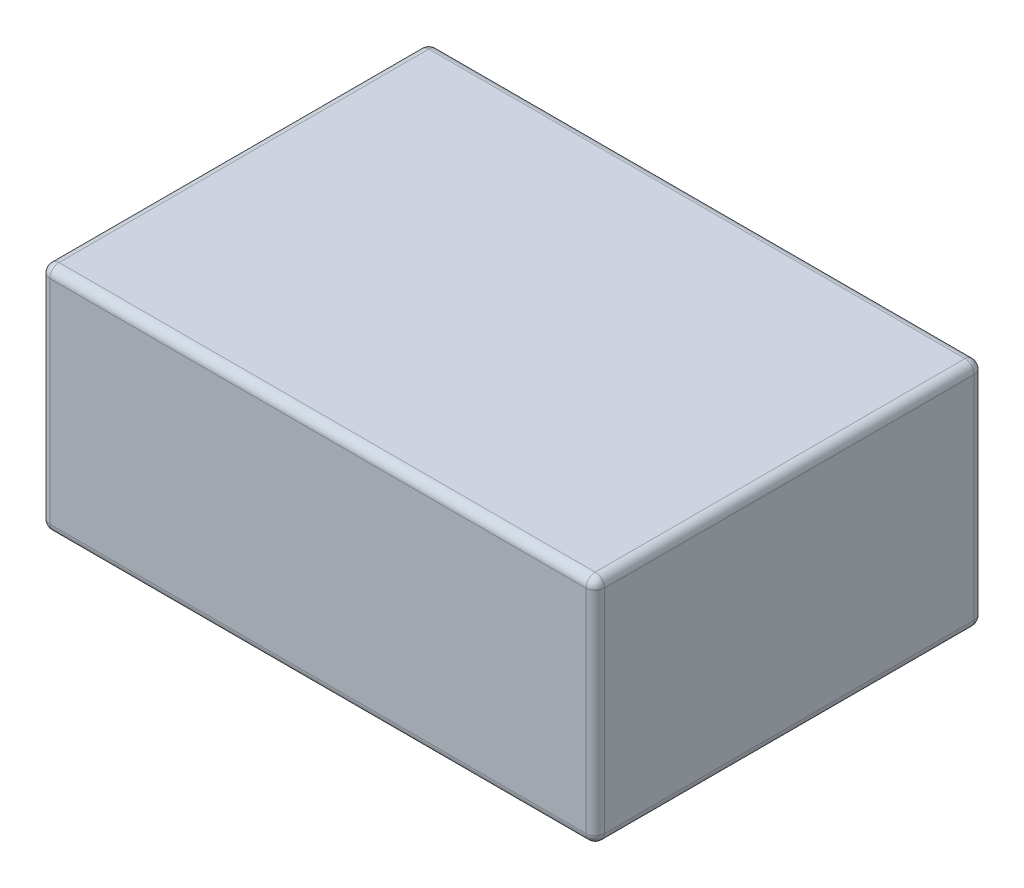
ISO-10303-21;
HEADER;
FILE_DESCRIPTION(('STEP AP214'),'2;1');
FILE_NAME('part.step','',(''),(''),'','','');
FILE_SCHEMA(('AUTOMOTIVE_DESIGN { 1 0 10303 214 1 1 1 1 }'));
ENDSEC;
DATA;
#1=APPLICATION_CONTEXT('core data for automotive mechanical design processes');
#2=APPLICATION_PROTOCOL_DEFINITION('international standard','automotive_design',2000,#1);
#3=PRODUCT_CONTEXT('',#1,'mechanical');
#4=PRODUCT('Part','Part','',(#3));
#5=PRODUCT_RELATED_PRODUCT_CATEGORY('part','',(#4));
#6=PRODUCT_DEFINITION_FORMATION('','',#4);
#7=PRODUCT_DEFINITION_CONTEXT('part definition',#1,'design');
#8=PRODUCT_DEFINITION('design','',#6,#7);
#9=PRODUCT_DEFINITION_SHAPE('','',#8);
#10=(LENGTH_UNIT() NAMED_UNIT(*) SI_UNIT(.MILLI.,.METRE.));
#11=(NAMED_UNIT(*) PLANE_ANGLE_UNIT() SI_UNIT($,.RADIAN.));
#12=(NAMED_UNIT(*) SI_UNIT($,.STERADIAN.) SOLID_ANGLE_UNIT());
#13=UNCERTAINTY_MEASURE_WITH_UNIT(LENGTH_MEASURE(1.E-05),#10,'distance_accuracy_value','');
#14=(GEOMETRIC_REPRESENTATION_CONTEXT(3) GLOBAL_UNCERTAINTY_ASSIGNED_CONTEXT((#13)) GLOBAL_UNIT_ASSIGNED_CONTEXT((#10,
#11,#12)) REPRESENTATION_CONTEXT('',''));
#15=CARTESIAN_POINT('',(0.,0.,0.));
#16=DIRECTION('',(0.,0.,1.));
#17=DIRECTION('',(1.,0.,0.));
#18=AXIS2_PLACEMENT_3D('',#15,#16,#17);
#19=CARTESIAN_POINT('',(-5.22915044598449E-11,50.,0.));
#20=DIRECTION('',(0.,0.,-1.));
#21=DIRECTION('',(-1.,0.,0.));
#22=AXIS2_PLACEMENT_3D('',#19,#20,#21);
#23=PLANE('',#22);
#24=DIRECTION('',(1.,0.,0.));
#25=VECTOR('',#24,1.);
#26=CARTESIAN_POINT('',(-5.22915044598449E-11,2.,0.));
#27=LINE('',#26,#25);
#28=CARTESIAN_POINT('',(1.99999999994771,2.,0.));
#29=VERTEX_POINT('',#28);
#30=CARTESIAN_POINT('',(117.999999999948,2.,0.));
#31=VERTEX_POINT('',#30);
#32=EDGE_CURVE('E230',#29,#31,#27,.T.);
#33=ORIENTED_EDGE('',*,*,#32,.T.);
#34=DIRECTION('',(0.,-1.,0.));
#35=VECTOR('',#34,1.);
#36=CARTESIAN_POINT('',(117.999999999948,50.,0.));
#37=LINE('',#36,#35);
#38=CARTESIAN_POINT('',(117.999999999948,48.,0.));
#39=VERTEX_POINT('',#38);
#40=EDGE_CURVE('E11',#31,#39,#37,.F.);
#41=ORIENTED_EDGE('',*,*,#40,.T.);
#42=DIRECTION('',(1.,0.,0.));
#43=VECTOR('',#42,1.);
#44=CARTESIAN_POINT('',(-5.22915044598449E-11,48.,0.));
#45=LINE('',#44,#43);
#46=CARTESIAN_POINT('',(1.99999999994771,48.,0.));
#47=VERTEX_POINT('',#46);
#48=EDGE_CURVE('E59',#39,#47,#45,.F.);
#49=ORIENTED_EDGE('',*,*,#48,.T.);
#50=DIRECTION('',(0.,-1.,0.));
#51=VECTOR('',#50,1.);
#52=CARTESIAN_POINT('',(1.99999999994771,2.,0.));
#53=LINE('',#52,#51);
#54=EDGE_CURVE('E306',#47,#29,#53,.T.);
#55=ORIENTED_EDGE('',*,*,#54,.T.);
#56=EDGE_LOOP('',(#33,#41,#49,#55));
#57=FACE_BOUND('',#56,.T.);
#58=ADVANCED_FACE('F49',(#57),#23,.F.);
#59=CARTESIAN_POINT('',(119.999999999948,50.,0.));
#60=DIRECTION('',(-1.,0.,0.));
#61=DIRECTION('',(0.,0.,1.));
#62=AXIS2_PLACEMENT_3D('',#59,#60,#61);
#63=PLANE('',#62);
#64=DIRECTION('',(0.,0.,-1.));
#65=VECTOR('',#64,1.);
#66=CARTESIAN_POINT('',(119.999999999948,48.,0.));
#67=LINE('',#66,#65);
#68=CARTESIAN_POINT('',(119.999999999948,48.,-82.));
#69=VERTEX_POINT('',#68);
#70=CARTESIAN_POINT('',(119.999999999948,48.,-2.));
#71=VERTEX_POINT('',#70);
#72=EDGE_CURVE('E300',#69,#71,#67,.F.);
#73=ORIENTED_EDGE('',*,*,#72,.T.);
#74=DIRECTION('',(0.,-1.,0.));
#75=VECTOR('',#74,1.);
#76=CARTESIAN_POINT('',(119.999999999948,50.,-2.));
#77=LINE('',#76,#75);
#78=CARTESIAN_POINT('',(119.999999999948,2.,-2.));
#79=VERTEX_POINT('',#78);
#80=EDGE_CURVE('E303',#71,#79,#77,.T.);
#81=ORIENTED_EDGE('',*,*,#80,.T.);
#82=DIRECTION('',(0.,0.,-1.));
#83=VECTOR('',#82,1.);
#84=CARTESIAN_POINT('',(119.999999999948,2.,0.));
#85=LINE('',#84,#83);
#86=CARTESIAN_POINT('',(119.999999999948,2.,-82.));
#87=VERTEX_POINT('',#86);
#88=EDGE_CURVE('E233',#79,#87,#85,.T.);
#89=ORIENTED_EDGE('',*,*,#88,.T.);
#90=DIRECTION('',(0.,-1.,0.));
#91=VECTOR('',#90,1.);
#92=CARTESIAN_POINT('',(119.999999999948,50.,-82.));
#93=LINE('',#92,#91);
#94=EDGE_CURVE('E297',#87,#69,#93,.F.);
#95=ORIENTED_EDGE('',*,*,#94,.T.);
#96=EDGE_LOOP('',(#73,#81,#89,#95));
#97=FACE_BOUND('',#96,.T.);
#98=ADVANCED_FACE('F454',(#97),#63,.F.);
#99=CARTESIAN_POINT('',(-5.22915044598449E-11,50.,-84.));
#100=DIRECTION('',(0.,0.,-1.));
#101=DIRECTION('',(-1.,0.,0.));
#102=AXIS2_PLACEMENT_3D('',#99,#100,#101);
#103=PLANE('',#102);
#104=DIRECTION('',(1.,0.,0.));
#105=VECTOR('',#104,1.);
#106=CARTESIAN_POINT('',(-5.22915044598449E-11,2.,-84.));
#107=LINE('',#106,#105);
#108=CARTESIAN_POINT('',(117.999999999948,2.,-84.));
#109=VERTEX_POINT('',#108);
#110=CARTESIAN_POINT('',(1.99999999994771,2.,-84.));
#111=VERTEX_POINT('',#110);
#112=EDGE_CURVE('E237',#109,#111,#107,.F.);
#113=ORIENTED_EDGE('',*,*,#112,.T.);
#114=DIRECTION('',(0.,-1.,0.));
#115=VECTOR('',#114,1.);
#116=CARTESIAN_POINT('',(1.99999999994771,50.,-84.));
#117=LINE('',#116,#115);
#118=CARTESIAN_POINT('',(1.99999999994771,48.,-84.));
#119=VERTEX_POINT('',#118);
#120=EDGE_CURVE('E294',#111,#119,#117,.F.);
#121=ORIENTED_EDGE('',*,*,#120,.T.);
#122=DIRECTION('',(1.,0.,0.));
#123=VECTOR('',#122,1.);
#124=CARTESIAN_POINT('',(-5.22915044598449E-11,48.,-84.));
#125=LINE('',#124,#123);
#126=CARTESIAN_POINT('',(117.999999999948,48.,-84.));
#127=VERTEX_POINT('',#126);
#128=EDGE_CURVE('E291',#119,#127,#125,.T.);
#129=ORIENTED_EDGE('',*,*,#128,.T.);
#130=DIRECTION('',(0.,-1.,0.));
#131=VECTOR('',#130,1.);
#132=CARTESIAN_POINT('',(117.999999999948,2.,-84.));
#133=LINE('',#132,#131);
#134=EDGE_CURVE('E288',#127,#109,#133,.T.);
#135=ORIENTED_EDGE('',*,*,#134,.T.);
#136=EDGE_LOOP('',(#113,#121,#129,#135));
#137=FACE_BOUND('',#136,.T.);
#138=ADVANCED_FACE('F391',(#137),#103,.T.);
#139=CARTESIAN_POINT('',(-5.22915044598449E-11,50.,0.));
#140=DIRECTION('',(-1.,0.,0.));
#141=DIRECTION('',(0.,0.,1.));
#142=AXIS2_PLACEMENT_3D('',#139,#140,#141);
#143=PLANE('',#142);
#144=DIRECTION('',(0.,0.,-1.));
#145=VECTOR('',#144,1.);
#146=CARTESIAN_POINT('',(-5.22915044598449E-11,2.,0.));
#147=LINE('',#146,#145);
#148=CARTESIAN_POINT('',(-5.22915044598449E-11,2.,-82.));
#149=VERTEX_POINT('',#148);
#150=CARTESIAN_POINT('',(-5.22915044598449E-11,2.,-2.));
#151=VERTEX_POINT('',#150);
#152=EDGE_CURVE('E226',#149,#151,#147,.F.);
#153=ORIENTED_EDGE('',*,*,#152,.T.);
#154=DIRECTION('',(0.,-1.,0.));
#155=VECTOR('',#154,1.);
#156=CARTESIAN_POINT('',(-5.22915044598449E-11,50.,-2.));
#157=LINE('',#156,#155);
#158=CARTESIAN_POINT('',(-5.22915044598449E-11,48.,-2.));
#159=VERTEX_POINT('',#158);
#160=EDGE_CURVE('E272',#151,#159,#157,.F.);
#161=ORIENTED_EDGE('',*,*,#160,.T.);
#162=DIRECTION('',(0.,0.,-1.));
#163=VECTOR('',#162,1.);
#164=CARTESIAN_POINT('',(-5.22915044598449E-11,48.,0.));
#165=LINE('',#164,#163);
#166=CARTESIAN_POINT('',(-5.22915044598449E-11,48.,-82.));
#167=VERTEX_POINT('',#166);
#168=EDGE_CURVE('E269',#159,#167,#165,.T.);
#169=ORIENTED_EDGE('',*,*,#168,.T.);
#170=DIRECTION('',(0.,-1.,0.));
#171=VECTOR('',#170,1.);
#172=CARTESIAN_POINT('',(-5.22915044598449E-11,50.,-82.));
#173=LINE('',#172,#171);
#174=EDGE_CURVE('E266',#167,#149,#173,.T.);
#175=ORIENTED_EDGE('',*,*,#174,.T.);
#176=EDGE_LOOP('',(#153,#161,#169,#175));
#177=FACE_BOUND('',#176,.T.);
#178=ADVANCED_FACE('F723',(#177),#143,.T.);
#179=CARTESIAN_POINT('',(0.,50.,0.));
#180=DIRECTION('',(0.,1.,0.));
#181=DIRECTION('',(0.,0.,1.));
#182=AXIS2_PLACEMENT_3D('',#179,#180,#181);
#183=PLANE('',#182);
#184=DIRECTION('',(1.,0.,0.));
#185=VECTOR('',#184,1.);
#186=CARTESIAN_POINT('',(0.,50.,-82.));
#187=LINE('',#186,#185);
#188=CARTESIAN_POINT('',(117.999999999948,50.,-82.));
#189=VERTEX_POINT('',#188);
#190=CARTESIAN_POINT('',(1.99999999994771,50.,-82.));
#191=VERTEX_POINT('',#190);
#192=EDGE_CURVE('E281',#189,#191,#187,.F.);
#193=ORIENTED_EDGE('',*,*,#192,.T.);
#194=DIRECTION('',(0.,0.,-1.));
#195=VECTOR('',#194,1.);
#196=CARTESIAN_POINT('',(1.99999999994771,50.,0.));
#197=LINE('',#196,#195);
#198=CARTESIAN_POINT('',(1.99999999994771,50.,-2.));
#199=VERTEX_POINT('',#198);
#200=EDGE_CURVE('E284',#191,#199,#197,.F.);
#201=ORIENTED_EDGE('',*,*,#200,.T.);
#202=DIRECTION('',(1.,0.,0.));
#203=VECTOR('',#202,1.);
#204=CARTESIAN_POINT('',(119.999999999948,50.,-2.));
#205=LINE('',#204,#203);
#206=CARTESIAN_POINT('',(117.999999999948,50.,-2.));
#207=VERTEX_POINT('',#206);
#208=EDGE_CURVE('E275',#199,#207,#205,.T.);
#209=ORIENTED_EDGE('',*,*,#208,.T.);
#210=DIRECTION('',(0.,0.,-1.));
#211=VECTOR('',#210,1.);
#212=CARTESIAN_POINT('',(117.999999999948,50.,-84.));
#213=LINE('',#212,#211);
#214=EDGE_CURVE('E278',#207,#189,#213,.T.);
#215=ORIENTED_EDGE('',*,*,#214,.T.);
#216=EDGE_LOOP('',(#193,#201,#209,#215));
#217=FACE_BOUND('',#216,.T.);
#218=ADVANCED_FACE('F383',(#217),#183,.T.);
#219=CARTESIAN_POINT('',(0.,0.,0.));
#220=DIRECTION('',(0.,1.,0.));
#221=DIRECTION('',(0.,0.,1.));
#222=AXIS2_PLACEMENT_3D('',#219,#220,#221);
#223=PLANE('',#222);
#224=DIRECTION('',(1.,0.,0.));
#225=VECTOR('',#224,1.);
#226=CARTESIAN_POINT('',(0.,0.,-69.));
#227=LINE('',#226,#225);
#228=CARTESIAN_POINT('',(2.,0.,-69.));
#229=VERTEX_POINT('',#228);
#230=CARTESIAN_POINT('',(118.,0.,-69.));
#231=VERTEX_POINT('',#230);
#232=EDGE_CURVE('E204',#229,#231,#227,.T.);
#233=ORIENTED_EDGE('',*,*,#232,.F.);
#234=DIRECTION('',(0.,0.,-1.));
#235=VECTOR('',#234,1.);
#236=CARTESIAN_POINT('',(1.99999999994771,0.,-84.));
#237=LINE('',#236,#235);
#238=CARTESIAN_POINT('',(1.99999999994771,0.,-82.));
#239=VERTEX_POINT('',#238);
#240=EDGE_CURVE('E222',#229,#239,#237,.T.);
#241=ORIENTED_EDGE('',*,*,#240,.T.);
#242=DIRECTION('',(1.,0.,0.));
#243=VECTOR('',#242,1.);
#244=CARTESIAN_POINT('',(119.999999999948,0.,-82.));
#245=LINE('',#244,#243);
#246=CARTESIAN_POINT('',(117.999999999948,0.,-82.));
#247=VERTEX_POINT('',#246);
#248=EDGE_CURVE('E215',#239,#247,#245,.T.);
#249=ORIENTED_EDGE('',*,*,#248,.T.);
#250=DIRECTION('',(0.,0.,-1.));
#251=VECTOR('',#250,1.);
#252=CARTESIAN_POINT('',(117.999999999948,0.,0.));
#253=LINE('',#252,#251);
#254=EDGE_CURVE('E219',#247,#231,#253,.F.);
#255=ORIENTED_EDGE('',*,*,#254,.T.);
#256=EDGE_LOOP('',(#233,#241,#249,#255));
#257=FACE_BOUND('',#256,.T.);
#258=ADVANCED_FACE('F410',(#257),#223,.F.);
#259=CARTESIAN_POINT('',(2.,-5.71729338541849,-2.));
#260=DIRECTION('',(0.,0.,1.));
#261=DIRECTION('',(1.,0.,0.));
#262=AXIS2_PLACEMENT_3D('',#259,#260,#261);
#263=PLANE('',#262);
#264=DIRECTION('',(0.,1.,0.));
#265=VECTOR('',#264,1.);
#266=CARTESIAN_POINT('',(2.,-5.71729338541849,-2.));
#267=LINE('',#266,#265);
#268=CARTESIAN_POINT('',(2.,0.,-2.));
#269=VERTEX_POINT('',#268);
#270=CARTESIAN_POINT('',(2.,48.,-2.));
#271=VERTEX_POINT('',#270);
#272=EDGE_CURVE('E184',#269,#271,#267,.T.);
#273=ORIENTED_EDGE('',*,*,#272,.T.);
#274=DIRECTION('',(1.,0.,0.));
#275=VECTOR('',#274,1.);
#276=CARTESIAN_POINT('',(2.,48.,-2.));
#277=LINE('',#276,#275);
#278=CARTESIAN_POINT('',(118.,48.,-2.));
#279=VERTEX_POINT('',#278);
#280=EDGE_CURVE('E176',#271,#279,#277,.T.);
#281=ORIENTED_EDGE('',*,*,#280,.T.);
#282=DIRECTION('',(0.,1.,0.));
#283=VECTOR('',#282,1.);
#284=CARTESIAN_POINT('',(118.,-5.71729338541849,-2.));
#285=LINE('',#284,#283);
#286=CARTESIAN_POINT('',(118.,0.,-2.));
#287=VERTEX_POINT('',#286);
#288=EDGE_CURVE('E156',#287,#279,#285,.T.);
#289=ORIENTED_EDGE('',*,*,#288,.F.);
#290=DIRECTION('',(1.,0.,0.));
#291=VECTOR('',#290,1.);
#292=CARTESIAN_POINT('',(0.,0.,-2.));
#293=LINE('',#292,#291);
#294=EDGE_CURVE('E212',#269,#287,#293,.T.);
#295=ORIENTED_EDGE('',*,*,#294,.F.);
#296=EDGE_LOOP('',(#273,#281,#289,#295));
#297=FACE_BOUND('',#296,.T.);
#298=ADVANCED_FACE('F182',(#297),#263,.F.);
#299=CARTESIAN_POINT('',(2.,-5.71729338541849,-2.));
#300=DIRECTION('',(1.,0.,0.));
#301=DIRECTION('',(0.,0.,-1.));
#302=AXIS2_PLACEMENT_3D('',#299,#300,#301);
#303=PLANE('',#302);
#304=DIRECTION('',(0.,0.,-1.));
#305=VECTOR('',#304,1.);
#306=CARTESIAN_POINT('',(2.,0.,0.));
#307=LINE('',#306,#305);
#308=EDGE_CURVE('E208',#269,#229,#307,.T.);
#309=ORIENTED_EDGE('',*,*,#308,.T.);
#310=DIRECTION('',(0.,1.,0.));
#311=VECTOR('',#310,1.);
#312=CARTESIAN_POINT('',(2.,-5.71729338541849,-69.));
#313=LINE('',#312,#311);
#314=CARTESIAN_POINT('',(2.,48.,-69.));
#315=VERTEX_POINT('',#314);
#316=EDGE_CURVE('E197',#229,#315,#313,.T.);
#317=ORIENTED_EDGE('',*,*,#316,.T.);
#318=DIRECTION('',(0.,0.,-1.));
#319=VECTOR('',#318,1.);
#320=CARTESIAN_POINT('',(2.,48.,-2.));
#321=LINE('',#320,#319);
#322=EDGE_CURVE('E170',#271,#315,#321,.T.);
#323=ORIENTED_EDGE('',*,*,#322,.F.);
#324=ORIENTED_EDGE('',*,*,#272,.F.);
#325=EDGE_LOOP('',(#309,#317,#323,#324));
#326=FACE_BOUND('',#325,.T.);
#327=ADVANCED_FACE('F676',(#326),#303,.T.);
#328=CARTESIAN_POINT('',(2.,-5.71729338541849,-69.));
#329=DIRECTION('',(0.,0.,1.));
#330=DIRECTION('',(1.,0.,0.));
#331=AXIS2_PLACEMENT_3D('',#328,#329,#330);
#332=PLANE('',#331);
#333=ORIENTED_EDGE('',*,*,#232,.T.);
#334=DIRECTION('',(0.,1.,0.));
#335=VECTOR('',#334,1.);
#336=CARTESIAN_POINT('',(118.,-5.71729338541849,-69.));
#337=LINE('',#336,#335);
#338=CARTESIAN_POINT('',(118.,48.,-69.));
#339=VERTEX_POINT('',#338);
#340=EDGE_CURVE('E169',#231,#339,#337,.T.);
#341=ORIENTED_EDGE('',*,*,#340,.T.);
#342=DIRECTION('',(1.,0.,0.));
#343=VECTOR('',#342,1.);
#344=CARTESIAN_POINT('',(2.,48.,-69.));
#345=LINE('',#344,#343);
#346=EDGE_CURVE('E179',#315,#339,#345,.T.);
#347=ORIENTED_EDGE('',*,*,#346,.F.);
#348=ORIENTED_EDGE('',*,*,#316,.F.);
#349=EDGE_LOOP('',(#333,#341,#347,#348));
#350=FACE_BOUND('',#349,.T.);
#351=ADVANCED_FACE('F667',(#350),#332,.T.);
#352=CARTESIAN_POINT('',(118.,-5.71729338541849,-2.));
#353=DIRECTION('',(1.,0.,0.));
#354=DIRECTION('',(0.,0.,-1.));
#355=AXIS2_PLACEMENT_3D('',#352,#353,#354);
#356=PLANE('',#355);
#357=ORIENTED_EDGE('',*,*,#288,.T.);
#358=DIRECTION('',(0.,0.,-1.));
#359=VECTOR('',#358,1.);
#360=CARTESIAN_POINT('',(118.,48.,-2.));
#361=LINE('',#360,#359);
#362=EDGE_CURVE('E160',#279,#339,#361,.T.);
#363=ORIENTED_EDGE('',*,*,#362,.T.);
#364=ORIENTED_EDGE('',*,*,#340,.F.);
#365=DIRECTION('',(0.,0.,-1.));
#366=VECTOR('',#365,1.);
#367=CARTESIAN_POINT('',(118.,0.,0.));
#368=LINE('',#367,#366);
#369=EDGE_CURVE('E163',#287,#231,#368,.T.);
#370=ORIENTED_EDGE('',*,*,#369,.F.);
#371=EDGE_LOOP('',(#357,#363,#364,#370));
#372=FACE_BOUND('',#371,.T.);
#373=ADVANCED_FACE('F158',(#372),#356,.F.);
#374=CARTESIAN_POINT('',(0.,48.,0.));
#375=DIRECTION('',(0.,1.,0.));
#376=DIRECTION('',(0.,0.,1.));
#377=AXIS2_PLACEMENT_3D('',#374,#375,#376);
#378=PLANE('',#377);
#379=ORIENTED_EDGE('',*,*,#280,.F.);
#380=ORIENTED_EDGE('',*,*,#322,.T.);
#381=ORIENTED_EDGE('',*,*,#346,.T.);
#382=ORIENTED_EDGE('',*,*,#362,.F.);
#383=EDGE_LOOP('',(#379,#380,#381,#382));
#384=FACE_BOUND('',#383,.T.);
#385=ADVANCED_FACE('F174',(#384),#378,.F.);
#386=CARTESIAN_POINT('',(117.999999999948,2.,0.));
#387=DIRECTION('',(0.,0.,-1.));
#388=DIRECTION('',(-1.,0.,0.));
#389=AXIS2_PLACEMENT_3D('',#386,#387,#388);
#390=CYLINDRICAL_SURFACE('',#389,2.);
#391=ORIENTED_EDGE('',*,*,#88,.F.);
#392=CARTESIAN_POINT('',(117.999999999948,2.,-2.));
#393=DIRECTION('',(0.,0.,-1.));
#394=DIRECTION('',(-1.,0.,0.));
#395=AXIS2_PLACEMENT_3D('',#392,#393,#394);
#396=CIRCLE('',#395,2.);
#397=EDGE_CURVE('E251',#79,#287,#396,.T.);
#398=ORIENTED_EDGE('',*,*,#397,.T.);
#399=ORIENTED_EDGE('',*,*,#369,.T.);
#400=ORIENTED_EDGE('',*,*,#254,.F.);
#401=CARTESIAN_POINT('',(117.999999999948,2.,-82.));
#402=DIRECTION('',(0.,0.,-1.));
#403=DIRECTION('',(-1.,0.,0.));
#404=AXIS2_PLACEMENT_3D('',#401,#402,#403);
#405=CIRCLE('',#404,2.);
#406=EDGE_CURVE('E248',#247,#87,#405,.F.);
#407=ORIENTED_EDGE('',*,*,#406,.T.);
#408=EDGE_LOOP('',(#391,#398,#399,#400,#407));
#409=FACE_BOUND('',#408,.T.);
#410=ADVANCED_FACE('F413',(#409),#390,.T.);
#411=CARTESIAN_POINT('',(-5.22915044598449E-11,2.,-2.));
#412=DIRECTION('',(1.,0.,0.));
#413=DIRECTION('',(0.,0.,-1.));
#414=AXIS2_PLACEMENT_3D('',#411,#412,#413);
#415=CYLINDRICAL_SURFACE('',#414,2.);
#416=ORIENTED_EDGE('',*,*,#294,.T.);
#417=CARTESIAN_POINT('',(117.999999999948,2.,-2.));
#418=DIRECTION('',(1.,0.,0.));
#419=DIRECTION('',(0.,0.,-1.));
#420=AXIS2_PLACEMENT_3D('',#417,#418,#419);
#421=CIRCLE('',#420,2.);
#422=EDGE_CURVE('E244',#287,#31,#421,.F.);
#423=ORIENTED_EDGE('',*,*,#422,.T.);
#424=ORIENTED_EDGE('',*,*,#32,.F.);
#425=CARTESIAN_POINT('',(1.99999999994771,2.,-2.));
#426=DIRECTION('',(1.,0.,0.));
#427=DIRECTION('',(0.,0.,-1.));
#428=AXIS2_PLACEMENT_3D('',#425,#426,#427);
#429=CIRCLE('',#428,2.);
#430=EDGE_CURVE('E241',#29,#269,#429,.T.);
#431=ORIENTED_EDGE('',*,*,#430,.T.);
#432=EDGE_LOOP('',(#416,#423,#424,#431));
#433=FACE_BOUND('',#432,.T.);
#434=ADVANCED_FACE('F425',(#433),#415,.T.);
#435=CARTESIAN_POINT('',(0.,2.,-82.));
#436=DIRECTION('',(-1.,0.,0.));
#437=DIRECTION('',(0.,0.,1.));
#438=AXIS2_PLACEMENT_3D('',#435,#436,#437);
#439=CYLINDRICAL_SURFACE('',#438,2.);
#440=ORIENTED_EDGE('',*,*,#248,.F.);
#441=CARTESIAN_POINT('',(1.99999999994771,2.,-82.));
#442=DIRECTION('',(-1.,0.,0.));
#443=DIRECTION('',(0.,0.,1.));
#444=AXIS2_PLACEMENT_3D('',#441,#442,#443);
#445=CIRCLE('',#444,2.);
#446=EDGE_CURVE('E263',#239,#111,#445,.F.);
#447=ORIENTED_EDGE('',*,*,#446,.T.);
#448=ORIENTED_EDGE('',*,*,#112,.F.);
#449=CARTESIAN_POINT('',(117.999999999948,2.,-82.));
#450=DIRECTION('',(-1.,0.,0.));
#451=DIRECTION('',(0.,0.,1.));
#452=AXIS2_PLACEMENT_3D('',#449,#450,#451);
#453=CIRCLE('',#452,2.);
#454=EDGE_CURVE('E260',#109,#247,#453,.T.);
#455=ORIENTED_EDGE('',*,*,#454,.T.);
#456=EDGE_LOOP('',(#440,#447,#448,#455));
#457=FACE_BOUND('',#456,.T.);
#458=ADVANCED_FACE('F405',(#457),#439,.T.);
#459=CARTESIAN_POINT('',(1.99999999994771,2.,0.));
#460=DIRECTION('',(0.,0.,1.));
#461=DIRECTION('',(1.,0.,0.));
#462=AXIS2_PLACEMENT_3D('',#459,#460,#461);
#463=CYLINDRICAL_SURFACE('',#462,2.);
#464=ORIENTED_EDGE('',*,*,#308,.F.);
#465=CARTESIAN_POINT('',(1.99999999994771,2.,-2.));
#466=DIRECTION('',(0.,0.,1.));
#467=DIRECTION('',(1.,0.,0.));
#468=AXIS2_PLACEMENT_3D('',#465,#466,#467);
#469=CIRCLE('',#468,2.);
#470=EDGE_CURVE('E257',#269,#151,#469,.F.);
#471=ORIENTED_EDGE('',*,*,#470,.T.);
#472=ORIENTED_EDGE('',*,*,#152,.F.);
#473=CARTESIAN_POINT('',(1.99999999994771,2.,-82.));
#474=DIRECTION('',(0.,0.,1.));
#475=DIRECTION('',(1.,0.,0.));
#476=AXIS2_PLACEMENT_3D('',#473,#474,#475);
#477=CIRCLE('',#476,2.);
#478=EDGE_CURVE('E254',#149,#239,#477,.T.);
#479=ORIENTED_EDGE('',*,*,#478,.T.);
#480=ORIENTED_EDGE('',*,*,#240,.F.);
#481=EDGE_LOOP('',(#464,#471,#472,#479,#480));
#482=FACE_BOUND('',#481,.T.);
#483=ADVANCED_FACE('F463',(#482),#463,.T.);
#484=CARTESIAN_POINT('',(1.99999999994771,2.,-82.));
#485=DIRECTION('',(0.,0.,1.));
#486=DIRECTION('',(1.,0.,0.));
#487=AXIS2_PLACEMENT_3D('',#484,#485,#486);
#488=SPHERICAL_SURFACE('',#487,2.);
#489=ORIENTED_EDGE('',*,*,#446,.F.);
#490=ORIENTED_EDGE('',*,*,#478,.F.);
#491=CARTESIAN_POINT('',(1.99999999994771,2.,-82.));
#492=DIRECTION('',(0.,1.,0.));
#493=DIRECTION('',(0.,0.,1.));
#494=AXIS2_PLACEMENT_3D('',#491,#492,#493);
#495=CIRCLE('',#494,2.);
#496=EDGE_CURVE('E53',#111,#149,#495,.T.);
#497=ORIENTED_EDGE('',*,*,#496,.F.);
#498=EDGE_LOOP('',(#489,#490,#497));
#499=FACE_BOUND('',#498,.T.);
#500=ADVANCED_FACE('F51',(#499),#488,.T.);
#501=CARTESIAN_POINT('',(1.99999999994771,50.,-82.));
#502=DIRECTION('',(0.,-1.,0.));
#503=DIRECTION('',(0.,0.,-1.));
#504=AXIS2_PLACEMENT_3D('',#501,#502,#503);
#505=CYLINDRICAL_SURFACE('',#504,2.);
#506=ORIENTED_EDGE('',*,*,#496,.T.);
#507=ORIENTED_EDGE('',*,*,#174,.F.);
#508=CARTESIAN_POINT('',(1.99999999994771,48.,-82.));
#509=DIRECTION('',(0.,1.,0.));
#510=DIRECTION('',(0.,0.,1.));
#511=AXIS2_PLACEMENT_3D('',#508,#509,#510);
#512=CIRCLE('',#511,2.);
#513=EDGE_CURVE('E189',#119,#167,#512,.T.);
#514=ORIENTED_EDGE('',*,*,#513,.F.);
#515=ORIENTED_EDGE('',*,*,#120,.F.);
#516=EDGE_LOOP('',(#506,#507,#514,#515));
#517=FACE_BOUND('',#516,.T.);
#518=ADVANCED_FACE('F597',(#517),#505,.T.);
#519=CARTESIAN_POINT('',(1.99999999994771,2.,-2.));
#520=DIRECTION('',(0.,0.,1.));
#521=DIRECTION('',(1.,0.,0.));
#522=AXIS2_PLACEMENT_3D('',#519,#520,#521);
#523=SPHERICAL_SURFACE('',#522,2.);
#524=ORIENTED_EDGE('',*,*,#470,.F.);
#525=ORIENTED_EDGE('',*,*,#430,.F.);
#526=CARTESIAN_POINT('',(1.99999999994771,2.,-2.));
#527=DIRECTION('',(0.,1.,0.));
#528=DIRECTION('',(0.,0.,1.));
#529=AXIS2_PLACEMENT_3D('',#526,#527,#528);
#530=CIRCLE('',#529,2.);
#531=EDGE_CURVE('E362',#151,#29,#530,.T.);
#532=ORIENTED_EDGE('',*,*,#531,.F.);
#533=EDGE_LOOP('',(#524,#525,#532));
#534=FACE_BOUND('',#533,.T.);
#535=ADVANCED_FACE('F587',(#534),#523,.T.);
#536=CARTESIAN_POINT('',(1.99999999994771,48.,-82.));
#537=DIRECTION('',(-1.,0.,0.));
#538=DIRECTION('',(0.,0.,1.));
#539=AXIS2_PLACEMENT_3D('',#536,#537,#538);
#540=SPHERICAL_SURFACE('',#539,2.);
#541=CARTESIAN_POINT('',(1.99999999994771,48.,-82.));
#542=DIRECTION('',(-1.,0.,0.));
#543=DIRECTION('',(0.,0.,1.));
#544=AXIS2_PLACEMENT_3D('',#541,#542,#543);
#545=CIRCLE('',#544,2.);
#546=EDGE_CURVE('E354',#119,#191,#545,.F.);
#547=ORIENTED_EDGE('',*,*,#546,.F.);
#548=ORIENTED_EDGE('',*,*,#513,.T.);
#549=CARTESIAN_POINT('',(1.99999999994771,48.,-82.));
#550=DIRECTION('',(0.,0.,-1.));
#551=DIRECTION('',(-1.,0.,0.));
#552=AXIS2_PLACEMENT_3D('',#549,#550,#551);
#553=CIRCLE('',#552,2.);
#554=EDGE_CURVE('E358',#191,#167,#553,.F.);
#555=ORIENTED_EDGE('',*,*,#554,.F.);
#556=EDGE_LOOP('',(#547,#548,#555));
#557=FACE_BOUND('',#556,.T.);
#558=ADVANCED_FACE('F371',(#557),#540,.T.);
#559=CARTESIAN_POINT('',(117.999999999948,2.,-82.));
#560=DIRECTION('',(0.,0.,1.));
#561=DIRECTION('',(1.,0.,0.));
#562=AXIS2_PLACEMENT_3D('',#559,#560,#561);
#563=SPHERICAL_SURFACE('',#562,2.);
#564=ORIENTED_EDGE('',*,*,#406,.F.);
#565=ORIENTED_EDGE('',*,*,#454,.F.);
#566=CARTESIAN_POINT('',(117.999999999948,2.,-82.));
#567=DIRECTION('',(0.,1.,0.));
#568=DIRECTION('',(0.,0.,1.));
#569=AXIS2_PLACEMENT_3D('',#566,#567,#568);
#570=CIRCLE('',#569,2.);
#571=EDGE_CURVE('E350',#87,#109,#570,.T.);
#572=ORIENTED_EDGE('',*,*,#571,.F.);
#573=EDGE_LOOP('',(#564,#565,#572));
#574=FACE_BOUND('',#573,.T.);
#575=ADVANCED_FACE('F402',(#574),#563,.T.);
#576=CARTESIAN_POINT('',(1.99999999994771,50.,-2.));
#577=DIRECTION('',(0.,1.,0.));
#578=DIRECTION('',(0.,0.,1.));
#579=AXIS2_PLACEMENT_3D('',#576,#577,#578);
#580=CYLINDRICAL_SURFACE('',#579,2.);
#581=ORIENTED_EDGE('',*,*,#531,.T.);
#582=ORIENTED_EDGE('',*,*,#54,.F.);
#583=CARTESIAN_POINT('',(1.99999999994771,48.,-2.));
#584=DIRECTION('',(0.,1.,0.));
#585=DIRECTION('',(0.,0.,1.));
#586=AXIS2_PLACEMENT_3D('',#583,#584,#585);
#587=CIRCLE('',#586,2.);
#588=EDGE_CURVE('E346',#159,#47,#587,.T.);
#589=ORIENTED_EDGE('',*,*,#588,.F.);
#590=ORIENTED_EDGE('',*,*,#160,.F.);
#591=EDGE_LOOP('',(#581,#582,#589,#590));
#592=FACE_BOUND('',#591,.T.);
#593=ADVANCED_FACE('F428',(#592),#580,.T.);
#594=CARTESIAN_POINT('',(1.99999999994771,48.,0.));
#595=DIRECTION('',(0.,0.,-1.));
#596=DIRECTION('',(-1.,0.,0.));
#597=AXIS2_PLACEMENT_3D('',#594,#595,#596);
#598=CYLINDRICAL_SURFACE('',#597,2.);
#599=ORIENTED_EDGE('',*,*,#554,.T.);
#600=ORIENTED_EDGE('',*,*,#168,.F.);
#601=CARTESIAN_POINT('',(1.99999999994771,48.,-2.));
#602=DIRECTION('',(0.,0.,1.));
#603=DIRECTION('',(1.,0.,0.));
#604=AXIS2_PLACEMENT_3D('',#601,#602,#603);
#605=CIRCLE('',#604,2.);
#606=EDGE_CURVE('E342',#199,#159,#605,.T.);
#607=ORIENTED_EDGE('',*,*,#606,.F.);
#608=ORIENTED_EDGE('',*,*,#200,.F.);
#609=EDGE_LOOP('',(#599,#600,#607,#608));
#610=FACE_BOUND('',#609,.T.);
#611=ADVANCED_FACE('F379',(#610),#598,.T.);
#612=CARTESIAN_POINT('',(-5.22915044598449E-11,48.,-82.));
#613=DIRECTION('',(1.,0.,0.));
#614=DIRECTION('',(0.,0.,-1.));
#615=AXIS2_PLACEMENT_3D('',#612,#613,#614);
#616=CYLINDRICAL_SURFACE('',#615,2.);
#617=ORIENTED_EDGE('',*,*,#546,.T.);
#618=ORIENTED_EDGE('',*,*,#192,.F.);
#619=CARTESIAN_POINT('',(117.999999999948,48.,-82.));
#620=DIRECTION('',(1.,0.,0.));
#621=DIRECTION('',(0.,0.,-1.));
#622=AXIS2_PLACEMENT_3D('',#619,#620,#621);
#623=CIRCLE('',#622,2.);
#624=EDGE_CURVE('E338',#127,#189,#623,.T.);
#625=ORIENTED_EDGE('',*,*,#624,.F.);
#626=ORIENTED_EDGE('',*,*,#128,.F.);
#627=EDGE_LOOP('',(#617,#618,#625,#626));
#628=FACE_BOUND('',#627,.T.);
#629=ADVANCED_FACE('F388',(#628),#616,.T.);
#630=CARTESIAN_POINT('',(117.999999999948,50.,-82.));
#631=DIRECTION('',(0.,1.,0.));
#632=DIRECTION('',(0.,0.,1.));
#633=AXIS2_PLACEMENT_3D('',#630,#631,#632);
#634=CYLINDRICAL_SURFACE('',#633,2.);
#635=ORIENTED_EDGE('',*,*,#571,.T.);
#636=ORIENTED_EDGE('',*,*,#134,.F.);
#637=CARTESIAN_POINT('',(117.999999999948,48.,-82.));
#638=DIRECTION('',(0.,1.,0.));
#639=DIRECTION('',(0.,0.,1.));
#640=AXIS2_PLACEMENT_3D('',#637,#638,#639);
#641=CIRCLE('',#640,2.);
#642=EDGE_CURVE('E334',#69,#127,#641,.T.);
#643=ORIENTED_EDGE('',*,*,#642,.F.);
#644=ORIENTED_EDGE('',*,*,#94,.F.);
#645=EDGE_LOOP('',(#635,#636,#643,#644));
#646=FACE_BOUND('',#645,.T.);
#647=ADVANCED_FACE('F395',(#646),#634,.T.);
#648=CARTESIAN_POINT('',(1.99999999994771,48.,-2.));
#649=DIRECTION('',(-1.,0.,0.));
#650=DIRECTION('',(0.,0.,1.));
#651=AXIS2_PLACEMENT_3D('',#648,#649,#650);
#652=SPHERICAL_SURFACE('',#651,2.);
#653=ORIENTED_EDGE('',*,*,#606,.T.);
#654=ORIENTED_EDGE('',*,*,#588,.T.);
#655=CARTESIAN_POINT('',(1.99999999994771,48.,-2.));
#656=DIRECTION('',(-1.,0.,0.));
#657=DIRECTION('',(0.,0.,1.));
#658=AXIS2_PLACEMENT_3D('',#655,#656,#657);
#659=CIRCLE('',#658,2.);
#660=EDGE_CURVE('E330',#199,#47,#659,.F.);
#661=ORIENTED_EDGE('',*,*,#660,.F.);
#662=EDGE_LOOP('',(#653,#654,#661));
#663=FACE_BOUND('',#662,.T.);
#664=ADVANCED_FACE('F433',(#663),#652,.T.);
#665=CARTESIAN_POINT('',(117.999999999948,48.,-82.));
#666=DIRECTION('',(0.,0.,-1.));
#667=DIRECTION('',(-1.,0.,0.));
#668=AXIS2_PLACEMENT_3D('',#665,#666,#667);
#669=SPHERICAL_SURFACE('',#668,2.);
#670=ORIENTED_EDGE('',*,*,#642,.T.);
#671=ORIENTED_EDGE('',*,*,#624,.T.);
#672=CARTESIAN_POINT('',(117.999999999948,48.,-82.));
#673=DIRECTION('',(0.,0.,-1.));
#674=DIRECTION('',(-1.,0.,0.));
#675=AXIS2_PLACEMENT_3D('',#672,#673,#674);
#676=CIRCLE('',#675,2.);
#677=EDGE_CURVE('E326',#69,#189,#676,.F.);
#678=ORIENTED_EDGE('',*,*,#677,.F.);
#679=EDGE_LOOP('',(#670,#671,#678));
#680=FACE_BOUND('',#679,.T.);
#681=ADVANCED_FACE('F444',(#680),#669,.T.);
#682=CARTESIAN_POINT('',(0.,48.,-2.));
#683=DIRECTION('',(-1.,0.,0.));
#684=DIRECTION('',(0.,0.,1.));
#685=AXIS2_PLACEMENT_3D('',#682,#683,#684);
#686=CYLINDRICAL_SURFACE('',#685,2.);
#687=ORIENTED_EDGE('',*,*,#660,.T.);
#688=ORIENTED_EDGE('',*,*,#48,.F.);
#689=CARTESIAN_POINT('',(117.999999999948,48.,-2.));
#690=DIRECTION('',(1.,0.,0.));
#691=DIRECTION('',(0.,0.,-1.));
#692=AXIS2_PLACEMENT_3D('',#689,#690,#691);
#693=CIRCLE('',#692,2.);
#694=EDGE_CURVE('E322',#207,#39,#693,.T.);
#695=ORIENTED_EDGE('',*,*,#694,.F.);
#696=ORIENTED_EDGE('',*,*,#208,.F.);
#697=EDGE_LOOP('',(#687,#688,#695,#696));
#698=FACE_BOUND('',#697,.T.);
#699=ADVANCED_FACE('F435',(#698),#686,.T.);
#700=CARTESIAN_POINT('',(117.999999999948,48.,0.));
#701=DIRECTION('',(0.,0.,1.));
#702=DIRECTION('',(1.,0.,0.));
#703=AXIS2_PLACEMENT_3D('',#700,#701,#702);
#704=CYLINDRICAL_SURFACE('',#703,2.);
#705=ORIENTED_EDGE('',*,*,#677,.T.);
#706=ORIENTED_EDGE('',*,*,#214,.F.);
#707=CARTESIAN_POINT('',(117.999999999948,48.,-2.));
#708=DIRECTION('',(0.,0.,1.));
#709=DIRECTION('',(1.,0.,0.));
#710=AXIS2_PLACEMENT_3D('',#707,#708,#709);
#711=CIRCLE('',#710,2.);
#712=EDGE_CURVE('E318',#71,#207,#711,.T.);
#713=ORIENTED_EDGE('',*,*,#712,.F.);
#714=ORIENTED_EDGE('',*,*,#72,.F.);
#715=EDGE_LOOP('',(#705,#706,#713,#714));
#716=FACE_BOUND('',#715,.T.);
#717=ADVANCED_FACE('F442',(#716),#704,.T.);
#718=CARTESIAN_POINT('',(117.999999999948,48.,-2.));
#719=DIRECTION('',(0.,1.,0.));
#720=DIRECTION('',(0.,0.,1.));
#721=AXIS2_PLACEMENT_3D('',#718,#719,#720);
#722=SPHERICAL_SURFACE('',#721,2.);
#723=ORIENTED_EDGE('',*,*,#712,.T.);
#724=ORIENTED_EDGE('',*,*,#694,.T.);
#725=CARTESIAN_POINT('',(117.999999999948,48.,-2.));
#726=DIRECTION('',(0.,1.,0.));
#727=DIRECTION('',(0.,0.,1.));
#728=AXIS2_PLACEMENT_3D('',#725,#726,#727);
#729=CIRCLE('',#728,2.);
#730=EDGE_CURVE('E314',#71,#39,#729,.F.);
#731=ORIENTED_EDGE('',*,*,#730,.F.);
#732=EDGE_LOOP('',(#723,#724,#731));
#733=FACE_BOUND('',#732,.T.);
#734=ADVANCED_FACE('F439',(#733),#722,.T.);
#735=CARTESIAN_POINT('',(117.999999999948,50.,-2.));
#736=DIRECTION('',(0.,-1.,0.));
#737=DIRECTION('',(0.,0.,-1.));
#738=AXIS2_PLACEMENT_3D('',#735,#736,#737);
#739=CYLINDRICAL_SURFACE('',#738,2.);
#740=ORIENTED_EDGE('',*,*,#730,.T.);
#741=ORIENTED_EDGE('',*,*,#40,.F.);
#742=CARTESIAN_POINT('',(117.999999999948,2.,-2.));
#743=DIRECTION('',(0.,-1.,0.));
#744=DIRECTION('',(0.,0.,-1.));
#745=AXIS2_PLACEMENT_3D('',#742,#743,#744);
#746=CIRCLE('',#745,2.);
#747=EDGE_CURVE('E311',#79,#31,#746,.T.);
#748=ORIENTED_EDGE('',*,*,#747,.F.);
#749=ORIENTED_EDGE('',*,*,#80,.F.);
#750=EDGE_LOOP('',(#740,#741,#748,#749));
#751=FACE_BOUND('',#750,.T.);
#752=ADVANCED_FACE('F421',(#751),#739,.T.);
#753=CARTESIAN_POINT('',(117.999999999948,2.,-2.));
#754=DIRECTION('',(0.,0.,1.));
#755=DIRECTION('',(1.,0.,0.));
#756=AXIS2_PLACEMENT_3D('',#753,#754,#755);
#757=SPHERICAL_SURFACE('',#756,2.);
#758=ORIENTED_EDGE('',*,*,#422,.F.);
#759=ORIENTED_EDGE('',*,*,#397,.F.);
#760=ORIENTED_EDGE('',*,*,#747,.T.);
#761=EDGE_LOOP('',(#758,#759,#760));
#762=FACE_BOUND('',#761,.T.);
#763=ADVANCED_FACE('F418',(#762),#757,.T.);
#764=CLOSED_SHELL('',(#58,#98,#138,#178,#218,#258,#298,#327,#351,#373,#385,#410,#434,#458,#483,
#500,#518,#535,#558,#575,#593,#611,#629,#647,#664,#681,#699,#717,#734,#752,#763));
#765=MANIFOLD_SOLID_BREP('B2',#764);
#766=ADVANCED_BREP_SHAPE_REPRESENTATION('',(#18,#765),#14);
#767=SHAPE_DEFINITION_REPRESENTATION(#9,#766);
ENDSEC;
END-ISO-10303-21;
